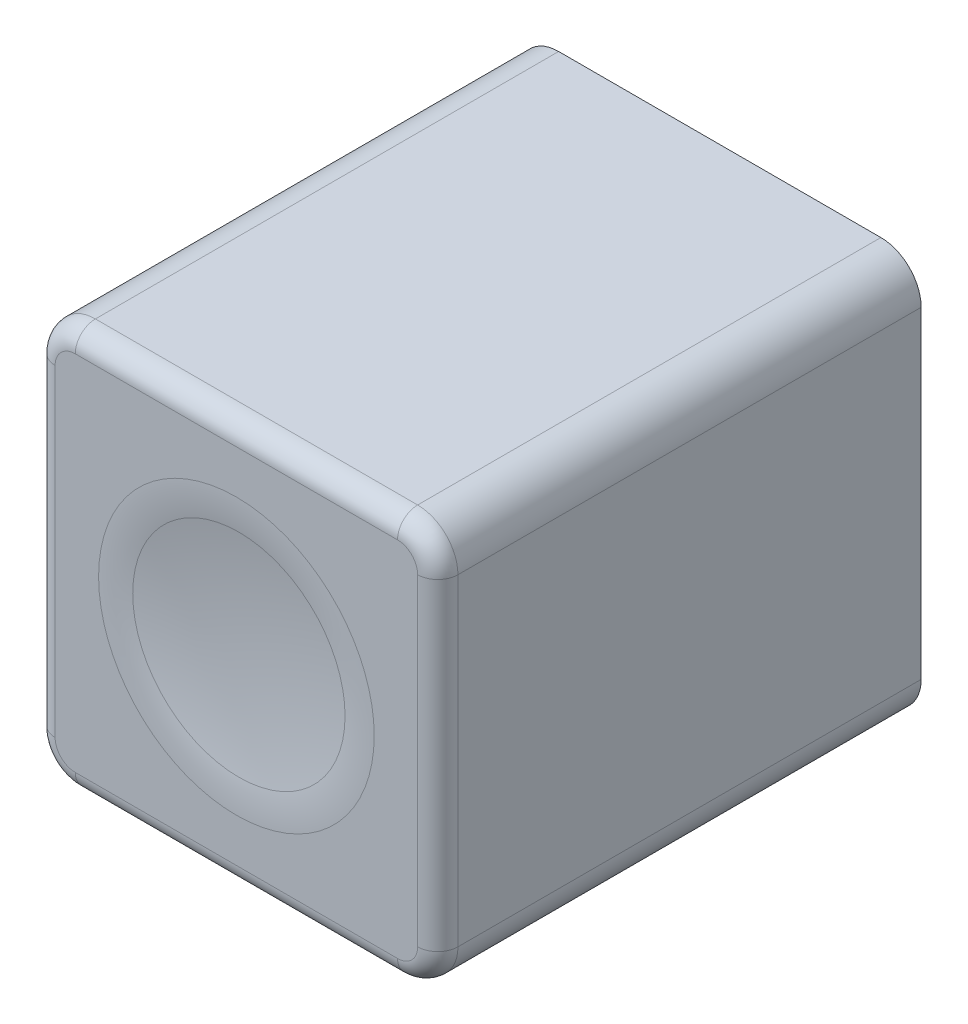
ISO-10303-21;
HEADER;
FILE_DESCRIPTION(('STEP AP214'),'2;1');
FILE_NAME('part.step','',(''),(''),'','','');
FILE_SCHEMA(('AUTOMOTIVE_DESIGN { 1 0 10303 214 1 1 1 1 }'));
ENDSEC;
DATA;
#1=APPLICATION_CONTEXT('core data for automotive mechanical design processes');
#2=APPLICATION_PROTOCOL_DEFINITION('international standard','automotive_design',2000,#1);
#3=PRODUCT_CONTEXT('',#1,'mechanical');
#4=PRODUCT('Part','Part','',(#3));
#5=PRODUCT_RELATED_PRODUCT_CATEGORY('part','',(#4));
#6=PRODUCT_DEFINITION_FORMATION('','',#4);
#7=PRODUCT_DEFINITION_CONTEXT('part definition',#1,'design');
#8=PRODUCT_DEFINITION('design','',#6,#7);
#9=PRODUCT_DEFINITION_SHAPE('','',#8);
#10=(LENGTH_UNIT() NAMED_UNIT(*) SI_UNIT(.MILLI.,.METRE.));
#11=(NAMED_UNIT(*) PLANE_ANGLE_UNIT() SI_UNIT($,.RADIAN.));
#12=(NAMED_UNIT(*) SI_UNIT($,.STERADIAN.) SOLID_ANGLE_UNIT());
#13=UNCERTAINTY_MEASURE_WITH_UNIT(LENGTH_MEASURE(1.E-05),#10,'distance_accuracy_value','');
#14=(GEOMETRIC_REPRESENTATION_CONTEXT(3) GLOBAL_UNCERTAINTY_ASSIGNED_CONTEXT((#13)) GLOBAL_UNIT_ASSIGNED_CONTEXT((#10,
#11,#12)) REPRESENTATION_CONTEXT('',''));
#15=CARTESIAN_POINT('',(0.,0.,0.));
#16=DIRECTION('',(0.,0.,1.));
#17=DIRECTION('',(1.,0.,0.));
#18=AXIS2_PLACEMENT_3D('',#15,#16,#17);
#19=CARTESIAN_POINT('',(0.,0.,2.));
#20=DIRECTION('',(0.,0.,1.));
#21=DIRECTION('',(1.,0.,0.));
#22=AXIS2_PLACEMENT_3D('',#19,#20,#21);
#23=PLANE('',#22);
#24=CARTESIAN_POINT('',(0.,0.,2.));
#25=DIRECTION('',(0.,0.,1.));
#26=DIRECTION('',(1.,0.,0.));
#27=AXIS2_PLACEMENT_3D('',#24,#25,#26);
#28=CIRCLE('',#27,3.42127144677008);
#29=CARTESIAN_POINT('',(3.42127144677008,0.,2.));
#30=VERTEX_POINT('',#29);
#31=EDGE_CURVE('E45',#30,#30,#28,.F.);
#32=ORIENTED_EDGE('',*,*,#31,.T.);
#33=EDGE_LOOP('',(#32));
#34=FACE_BOUND('',#33,.T.);
#35=DIRECTION('',(0.,-1.,0.));
#36=VECTOR('',#35,1.);
#37=CARTESIAN_POINT('',(-4.49999999999999,0.,2.));
#38=LINE('',#37,#36);
#39=CARTESIAN_POINT('',(-4.49999999999999,4.00000000000001,2.));
#40=VERTEX_POINT('',#39);
#41=CARTESIAN_POINT('',(-4.49999999999999,-3.99999999999999,2.));
#42=VERTEX_POINT('',#41);
#43=EDGE_CURVE('E183',#40,#42,#38,.T.);
#44=ORIENTED_EDGE('',*,*,#43,.T.);
#45=CARTESIAN_POINT('',(-3.99999999999999,-3.99999999999999,2.));
#46=DIRECTION('',(0.,0.,1.));
#47=DIRECTION('',(1.,0.,0.));
#48=AXIS2_PLACEMENT_3D('',#45,#46,#47);
#49=CIRCLE('',#48,0.5);
#50=CARTESIAN_POINT('',(-3.99999999999999,-4.49999999999999,2.));
#51=VERTEX_POINT('',#50);
#52=EDGE_CURVE('E185',#42,#51,#49,.T.);
#53=ORIENTED_EDGE('',*,*,#52,.T.);
#54=DIRECTION('',(1.,0.,0.));
#55=VECTOR('',#54,1.);
#56=CARTESIAN_POINT('',(0.,-4.49999999999999,2.));
#57=LINE('',#56,#55);
#58=CARTESIAN_POINT('',(4.00000000000001,-4.49999999999999,2.));
#59=VERTEX_POINT('',#58);
#60=EDGE_CURVE('E171',#51,#59,#57,.T.);
#61=ORIENTED_EDGE('',*,*,#60,.T.);
#62=CARTESIAN_POINT('',(4.00000000000001,-3.99999999999999,2.));
#63=DIRECTION('',(0.,0.,1.));
#64=DIRECTION('',(1.,0.,0.));
#65=AXIS2_PLACEMENT_3D('',#62,#63,#64);
#66=CIRCLE('',#65,0.5);
#67=CARTESIAN_POINT('',(4.50000000000001,-3.99999999999999,2.));
#68=VERTEX_POINT('',#67);
#69=EDGE_CURVE('E173',#59,#68,#66,.T.);
#70=ORIENTED_EDGE('',*,*,#69,.T.);
#71=DIRECTION('',(0.,1.,0.));
#72=VECTOR('',#71,1.);
#73=CARTESIAN_POINT('',(4.50000000000001,0.,2.));
#74=LINE('',#73,#72);
#75=CARTESIAN_POINT('',(4.50000000000001,4.00000000000001,2.));
#76=VERTEX_POINT('',#75);
#77=EDGE_CURVE('E175',#68,#76,#74,.T.);
#78=ORIENTED_EDGE('',*,*,#77,.T.);
#79=CARTESIAN_POINT('',(4.00000000000001,4.00000000000001,2.));
#80=DIRECTION('',(0.,0.,1.));
#81=DIRECTION('',(1.,0.,0.));
#82=AXIS2_PLACEMENT_3D('',#79,#80,#81);
#83=CIRCLE('',#82,0.5);
#84=CARTESIAN_POINT('',(4.00000000000001,4.50000000000001,2.));
#85=VERTEX_POINT('',#84);
#86=EDGE_CURVE('E177',#76,#85,#83,.T.);
#87=ORIENTED_EDGE('',*,*,#86,.T.);
#88=DIRECTION('',(-1.,0.,0.));
#89=VECTOR('',#88,1.);
#90=CARTESIAN_POINT('',(0.,4.50000000000001,2.));
#91=LINE('',#90,#89);
#92=CARTESIAN_POINT('',(-3.99999999999999,4.50000000000001,2.));
#93=VERTEX_POINT('',#92);
#94=EDGE_CURVE('E179',#85,#93,#91,.T.);
#95=ORIENTED_EDGE('',*,*,#94,.T.);
#96=CARTESIAN_POINT('',(-3.99999999999999,4.00000000000001,2.));
#97=DIRECTION('',(0.,0.,1.));
#98=DIRECTION('',(1.,0.,0.));
#99=AXIS2_PLACEMENT_3D('',#96,#97,#98);
#100=CIRCLE('',#99,0.5);
#101=EDGE_CURVE('E181',#93,#40,#100,.T.);
#102=ORIENTED_EDGE('',*,*,#101,.T.);
#103=EDGE_LOOP('',(#44,#53,#61,#70,#78,#87,#95,#102));
#104=FACE_BOUND('',#103,.T.);
#105=ADVANCED_FACE('F37',(#34,#104),#23,.T.);
#106=CARTESIAN_POINT('',(-4.99999999999999,5.00000000000001,-10.));
#107=DIRECTION('',(-1.,0.,0.));
#108=DIRECTION('',(0.,-1.,0.));
#109=AXIS2_PLACEMENT_3D('',#106,#107,#108);
#110=PLANE('',#109);
#111=DIRECTION('',(0.,0.,1.));
#112=VECTOR('',#111,1.);
#113=CARTESIAN_POINT('',(-4.99999999999999,-3.99999999999999,-10.));
#114=LINE('',#113,#112);
#115=CARTESIAN_POINT('',(-4.99999999999999,-3.99999999999999,-10.));
#116=VERTEX_POINT('',#115);
#117=CARTESIAN_POINT('',(-4.99999999999999,-3.99999999999999,1.5));
#118=VERTEX_POINT('',#117);
#119=EDGE_CURVE('E155',#116,#118,#114,.T.);
#120=ORIENTED_EDGE('',*,*,#119,.T.);
#121=DIRECTION('',(0.,-1.,0.));
#122=VECTOR('',#121,1.);
#123=CARTESIAN_POINT('',(-4.99999999999999,5.00000000000001,1.5));
#124=LINE('',#123,#122);
#125=CARTESIAN_POINT('',(-4.99999999999999,4.00000000000001,1.5));
#126=VERTEX_POINT('',#125);
#127=EDGE_CURVE('E190',#118,#126,#124,.F.);
#128=ORIENTED_EDGE('',*,*,#127,.T.);
#129=DIRECTION('',(0.,0.,1.));
#130=VECTOR('',#129,1.);
#131=CARTESIAN_POINT('',(-4.99999999999999,4.00000000000001,-10.));
#132=LINE('',#131,#130);
#133=CARTESIAN_POINT('',(-4.99999999999999,4.00000000000001,-10.));
#134=VERTEX_POINT('',#133);
#135=EDGE_CURVE('E158',#126,#134,#132,.F.);
#136=ORIENTED_EDGE('',*,*,#135,.T.);
#137=DIRECTION('',(0.,-1.,0.));
#138=VECTOR('',#137,1.);
#139=CARTESIAN_POINT('',(-4.99999999999999,5.00000000000001,-10.));
#140=LINE('',#139,#138);
#141=EDGE_CURVE('E150',#134,#116,#140,.T.);
#142=ORIENTED_EDGE('',*,*,#141,.T.);
#143=EDGE_LOOP('',(#120,#128,#136,#142));
#144=FACE_BOUND('',#143,.T.);
#145=ADVANCED_FACE('F238',(#144),#110,.T.);
#146=CARTESIAN_POINT('',(-4.99999999999999,5.00000000000001,-10.));
#147=DIRECTION('',(0.,1.,0.));
#148=DIRECTION('',(-1.,0.,0.));
#149=AXIS2_PLACEMENT_3D('',#146,#147,#148);
#150=PLANE('',#149);
#151=DIRECTION('',(0.,0.,1.));
#152=VECTOR('',#151,1.);
#153=CARTESIAN_POINT('',(-3.99999999999999,5.00000000000001,-10.));
#154=LINE('',#153,#152);
#155=CARTESIAN_POINT('',(-3.99999999999999,5.00000000000001,-10.));
#156=VERTEX_POINT('',#155);
#157=CARTESIAN_POINT('',(-3.99999999999999,5.00000000000001,1.5));
#158=VERTEX_POINT('',#157);
#159=EDGE_CURVE('E168',#156,#158,#154,.T.);
#160=ORIENTED_EDGE('',*,*,#159,.T.);
#161=DIRECTION('',(-1.,0.,0.));
#162=VECTOR('',#161,1.);
#163=CARTESIAN_POINT('',(-4.99999999999999,5.00000000000001,1.5));
#164=LINE('',#163,#162);
#165=CARTESIAN_POINT('',(4.00000000000001,5.00000000000001,1.5));
#166=VERTEX_POINT('',#165);
#167=EDGE_CURVE('E194',#158,#166,#164,.F.);
#168=ORIENTED_EDGE('',*,*,#167,.T.);
#169=DIRECTION('',(0.,0.,1.));
#170=VECTOR('',#169,1.);
#171=CARTESIAN_POINT('',(4.00000000000001,5.00000000000001,-10.));
#172=LINE('',#171,#170);
#173=CARTESIAN_POINT('',(4.00000000000001,5.00000000000001,-10.));
#174=VERTEX_POINT('',#173);
#175=EDGE_CURVE('E166',#166,#174,#172,.F.);
#176=ORIENTED_EDGE('',*,*,#175,.T.);
#177=DIRECTION('',(-1.,0.,0.));
#178=VECTOR('',#177,1.);
#179=CARTESIAN_POINT('',(-4.99999999999999,5.00000000000001,-10.));
#180=LINE('',#179,#178);
#181=EDGE_CURVE('E139',#174,#156,#180,.T.);
#182=ORIENTED_EDGE('',*,*,#181,.T.);
#183=EDGE_LOOP('',(#160,#168,#176,#182));
#184=FACE_BOUND('',#183,.T.);
#185=ADVANCED_FACE('F243',(#184),#150,.T.);
#186=CARTESIAN_POINT('',(5.00000000000001,5.00000000000001,-10.));
#187=DIRECTION('',(1.,0.,0.));
#188=DIRECTION('',(0.,1.,0.));
#189=AXIS2_PLACEMENT_3D('',#186,#187,#188);
#190=PLANE('',#189);
#191=DIRECTION('',(0.,0.,1.));
#192=VECTOR('',#191,1.);
#193=CARTESIAN_POINT('',(5.00000000000001,4.00000000000001,-10.));
#194=LINE('',#193,#192);
#195=CARTESIAN_POINT('',(5.00000000000001,4.00000000000001,-10.));
#196=VERTEX_POINT('',#195);
#197=CARTESIAN_POINT('',(5.00000000000001,4.00000000000001,1.5));
#198=VERTEX_POINT('',#197);
#199=EDGE_CURVE('E323',#196,#198,#194,.T.);
#200=ORIENTED_EDGE('',*,*,#199,.T.);
#201=DIRECTION('',(0.,1.,0.));
#202=VECTOR('',#201,1.);
#203=CARTESIAN_POINT('',(5.00000000000001,5.00000000000001,1.5));
#204=LINE('',#203,#202);
#205=CARTESIAN_POINT('',(5.00000000000001,-3.99999999999999,1.5));
#206=VERTEX_POINT('',#205);
#207=EDGE_CURVE('E60',#198,#206,#204,.F.);
#208=ORIENTED_EDGE('',*,*,#207,.T.);
#209=DIRECTION('',(0.,0.,1.));
#210=VECTOR('',#209,1.);
#211=CARTESIAN_POINT('',(5.00000000000001,-3.99999999999999,-10.));
#212=LINE('',#211,#210);
#213=CARTESIAN_POINT('',(5.00000000000001,-3.99999999999999,-10.));
#214=VERTEX_POINT('',#213);
#215=EDGE_CURVE('E325',#206,#214,#212,.F.);
#216=ORIENTED_EDGE('',*,*,#215,.T.);
#217=DIRECTION('',(0.,1.,0.));
#218=VECTOR('',#217,1.);
#219=CARTESIAN_POINT('',(5.00000000000001,5.00000000000001,-10.));
#220=LINE('',#219,#218);
#221=EDGE_CURVE('E149',#214,#196,#220,.T.);
#222=ORIENTED_EDGE('',*,*,#221,.T.);
#223=EDGE_LOOP('',(#200,#208,#216,#222));
#224=FACE_BOUND('',#223,.T.);
#225=ADVANCED_FACE('F252',(#224),#190,.T.);
#226=CARTESIAN_POINT('',(-4.99999999999999,-4.99999999999999,-10.));
#227=DIRECTION('',(0.,-1.,0.));
#228=DIRECTION('',(1.,0.,0.));
#229=AXIS2_PLACEMENT_3D('',#226,#227,#228);
#230=PLANE('',#229);
#231=DIRECTION('',(0.,0.,1.));
#232=VECTOR('',#231,1.);
#233=CARTESIAN_POINT('',(4.00000000000001,-4.99999999999999,-10.));
#234=LINE('',#233,#232);
#235=CARTESIAN_POINT('',(4.00000000000001,-4.99999999999999,-10.));
#236=VERTEX_POINT('',#235);
#237=CARTESIAN_POINT('',(4.00000000000001,-4.99999999999999,1.5));
#238=VERTEX_POINT('',#237);
#239=EDGE_CURVE('E138',#236,#238,#234,.T.);
#240=ORIENTED_EDGE('',*,*,#239,.T.);
#241=DIRECTION('',(1.,0.,0.));
#242=VECTOR('',#241,1.);
#243=CARTESIAN_POINT('',(-4.99999999999999,-4.99999999999999,1.5));
#244=LINE('',#243,#242);
#245=CARTESIAN_POINT('',(-3.99999999999999,-4.99999999999999,1.5));
#246=VERTEX_POINT('',#245);
#247=EDGE_CURVE('E133',#238,#246,#244,.F.);
#248=ORIENTED_EDGE('',*,*,#247,.T.);
#249=DIRECTION('',(0.,0.,1.));
#250=VECTOR('',#249,1.);
#251=CARTESIAN_POINT('',(-3.99999999999999,-4.99999999999999,-10.));
#252=LINE('',#251,#250);
#253=CARTESIAN_POINT('',(-3.99999999999999,-4.99999999999999,-10.));
#254=VERTEX_POINT('',#253);
#255=EDGE_CURVE('E128',#246,#254,#252,.F.);
#256=ORIENTED_EDGE('',*,*,#255,.T.);
#257=DIRECTION('',(1.,0.,0.));
#258=VECTOR('',#257,1.);
#259=CARTESIAN_POINT('',(-4.99999999999999,-4.99999999999999,-10.));
#260=LINE('',#259,#258);
#261=EDGE_CURVE('E131',#254,#236,#260,.T.);
#262=ORIENTED_EDGE('',*,*,#261,.T.);
#263=EDGE_LOOP('',(#240,#248,#256,#262));
#264=FACE_BOUND('',#263,.T.);
#265=ADVANCED_FACE('F130',(#264),#230,.T.);
#266=CARTESIAN_POINT('',(0.,0.,-10.));
#267=DIRECTION('',(0.,0.,1.));
#268=DIRECTION('',(1.,0.,0.));
#269=AXIS2_PLACEMENT_3D('',#266,#267,#268);
#270=PLANE('',#269);
#271=ORIENTED_EDGE('',*,*,#221,.F.);
#272=CARTESIAN_POINT('',(4.00000000000001,-3.99999999999999,-10.));
#273=DIRECTION('',(0.,0.,1.));
#274=DIRECTION('',(1.,0.,0.));
#275=AXIS2_PLACEMENT_3D('',#272,#273,#274);
#276=CIRCLE('',#275,1.);
#277=EDGE_CURVE('E148',#214,#236,#276,.F.);
#278=ORIENTED_EDGE('',*,*,#277,.T.);
#279=ORIENTED_EDGE('',*,*,#261,.F.);
#280=CARTESIAN_POINT('',(-3.99999999999999,-3.99999999999999,-10.));
#281=DIRECTION('',(0.,0.,1.));
#282=DIRECTION('',(1.,0.,0.));
#283=AXIS2_PLACEMENT_3D('',#280,#281,#282);
#284=CIRCLE('',#283,1.);
#285=EDGE_CURVE('E145',#254,#116,#284,.F.);
#286=ORIENTED_EDGE('',*,*,#285,.T.);
#287=ORIENTED_EDGE('',*,*,#141,.F.);
#288=CARTESIAN_POINT('',(-3.99999999999999,4.00000000000001,-10.));
#289=DIRECTION('',(0.,0.,1.));
#290=DIRECTION('',(1.,0.,0.));
#291=AXIS2_PLACEMENT_3D('',#288,#289,#290);
#292=CIRCLE('',#291,1.);
#293=EDGE_CURVE('E156',#134,#156,#292,.F.);
#294=ORIENTED_EDGE('',*,*,#293,.T.);
#295=ORIENTED_EDGE('',*,*,#181,.F.);
#296=CARTESIAN_POINT('',(4.00000000000001,4.00000000000001,-10.));
#297=DIRECTION('',(0.,0.,1.));
#298=DIRECTION('',(1.,0.,0.));
#299=AXIS2_PLACEMENT_3D('',#296,#297,#298);
#300=CIRCLE('',#299,1.);
#301=EDGE_CURVE('E160',#174,#196,#300,.F.);
#302=ORIENTED_EDGE('',*,*,#301,.T.);
#303=EDGE_LOOP('',(#271,#278,#279,#286,#287,#294,#295,#302));
#304=FACE_BOUND('',#303,.T.);
#305=ADVANCED_FACE('F143',(#304),#270,.F.);
#306=CARTESIAN_POINT('',(4.00000000000001,-3.99999999999999,-10.));
#307=DIRECTION('',(0.,0.,1.));
#308=DIRECTION('',(1.,0.,0.));
#309=AXIS2_PLACEMENT_3D('',#306,#307,#308);
#310=CYLINDRICAL_SURFACE('',#309,1.);
#311=ORIENTED_EDGE('',*,*,#215,.F.);
#312=CARTESIAN_POINT('',(4.00000000000001,-3.99999999999999,1.5));
#313=DIRECTION('',(0.,0.,1.));
#314=DIRECTION('',(1.,0.,0.));
#315=AXIS2_PLACEMENT_3D('',#312,#313,#314);
#316=CIRCLE('',#315,1.);
#317=EDGE_CURVE('E52',#206,#238,#316,.F.);
#318=ORIENTED_EDGE('',*,*,#317,.T.);
#319=ORIENTED_EDGE('',*,*,#239,.F.);
#320=ORIENTED_EDGE('',*,*,#277,.F.);
#321=EDGE_LOOP('',(#311,#318,#319,#320));
#322=FACE_BOUND('',#321,.T.);
#323=ADVANCED_FACE('F249',(#322),#310,.T.);
#324=CARTESIAN_POINT('',(-3.99999999999999,-3.99999999999999,-10.));
#325=DIRECTION('',(0.,0.,1.));
#326=DIRECTION('',(1.,0.,0.));
#327=AXIS2_PLACEMENT_3D('',#324,#325,#326);
#328=CYLINDRICAL_SURFACE('',#327,1.);
#329=ORIENTED_EDGE('',*,*,#255,.F.);
#330=CARTESIAN_POINT('',(-3.99999999999999,-3.99999999999999,1.5));
#331=DIRECTION('',(0.,0.,1.));
#332=DIRECTION('',(1.,0.,0.));
#333=AXIS2_PLACEMENT_3D('',#330,#331,#332);
#334=CIRCLE('',#333,1.);
#335=EDGE_CURVE('E188',#246,#118,#334,.F.);
#336=ORIENTED_EDGE('',*,*,#335,.T.);
#337=ORIENTED_EDGE('',*,*,#119,.F.);
#338=ORIENTED_EDGE('',*,*,#285,.F.);
#339=EDGE_LOOP('',(#329,#336,#337,#338));
#340=FACE_BOUND('',#339,.T.);
#341=ADVANCED_FACE('F153',(#340),#328,.T.);
#342=CARTESIAN_POINT('',(-3.99999999999999,4.00000000000001,-10.));
#343=DIRECTION('',(0.,0.,1.));
#344=DIRECTION('',(1.,0.,0.));
#345=AXIS2_PLACEMENT_3D('',#342,#343,#344);
#346=CYLINDRICAL_SURFACE('',#345,1.);
#347=ORIENTED_EDGE('',*,*,#135,.F.);
#348=CARTESIAN_POINT('',(-3.99999999999999,4.00000000000001,1.5));
#349=DIRECTION('',(0.,0.,1.));
#350=DIRECTION('',(1.,0.,0.));
#351=AXIS2_PLACEMENT_3D('',#348,#349,#350);
#352=CIRCLE('',#351,1.);
#353=EDGE_CURVE('E192',#126,#158,#352,.F.);
#354=ORIENTED_EDGE('',*,*,#353,.T.);
#355=ORIENTED_EDGE('',*,*,#159,.F.);
#356=ORIENTED_EDGE('',*,*,#293,.F.);
#357=EDGE_LOOP('',(#347,#354,#355,#356));
#358=FACE_BOUND('',#357,.T.);
#359=ADVANCED_FACE('F262',(#358),#346,.T.);
#360=CARTESIAN_POINT('',(4.00000000000001,4.00000000000001,-10.));
#361=DIRECTION('',(0.,0.,1.));
#362=DIRECTION('',(1.,0.,0.));
#363=AXIS2_PLACEMENT_3D('',#360,#361,#362);
#364=CYLINDRICAL_SURFACE('',#363,1.);
#365=ORIENTED_EDGE('',*,*,#175,.F.);
#366=CARTESIAN_POINT('',(4.00000000000001,4.00000000000001,1.5));
#367=DIRECTION('',(0.,0.,1.));
#368=DIRECTION('',(1.,0.,0.));
#369=AXIS2_PLACEMENT_3D('',#366,#367,#368);
#370=CIRCLE('',#369,1.);
#371=EDGE_CURVE('E196',#166,#198,#370,.F.);
#372=ORIENTED_EDGE('',*,*,#371,.T.);
#373=ORIENTED_EDGE('',*,*,#199,.F.);
#374=ORIENTED_EDGE('',*,*,#301,.F.);
#375=EDGE_LOOP('',(#365,#372,#373,#374));
#376=FACE_BOUND('',#375,.T.);
#377=ADVANCED_FACE('F265',(#376),#364,.T.);
#378=CARTESIAN_POINT('',(4.00000000000001,4.00000000000001,1.5));
#379=DIRECTION('',(0.,0.,1.));
#380=DIRECTION('',(1.,0.,0.));
#381=AXIS2_PLACEMENT_3D('',#378,#379,#380);
#382=DEGENERATE_TOROIDAL_SURFACE('',#381,0.5,0.5,.T.);
#383=CARTESIAN_POINT('',(4.50000000000001,4.00000000000001,1.5));
#384=DIRECTION('',(0.,-1.,0.));
#385=DIRECTION('',(0.,0.,-1.));
#386=AXIS2_PLACEMENT_3D('',#383,#384,#385);
#387=CIRCLE('',#386,0.5);
#388=EDGE_CURVE('E217',#198,#76,#387,.T.);
#389=ORIENTED_EDGE('',*,*,#388,.F.);
#390=ORIENTED_EDGE('',*,*,#371,.F.);
#391=CARTESIAN_POINT('',(4.00000000000001,4.50000000000001,1.5));
#392=DIRECTION('',(-1.,0.,0.));
#393=DIRECTION('',(0.,0.,1.));
#394=AXIS2_PLACEMENT_3D('',#391,#392,#393);
#395=CIRCLE('',#394,0.5);
#396=EDGE_CURVE('E220',#85,#166,#395,.T.);
#397=ORIENTED_EDGE('',*,*,#396,.F.);
#398=ORIENTED_EDGE('',*,*,#86,.F.);
#399=EDGE_LOOP('',(#389,#390,#397,#398));
#400=FACE_BOUND('',#399,.T.);
#401=ADVANCED_FACE('F269',(#400),#382,.T.);
#402=CARTESIAN_POINT('',(0.,4.50000000000001,1.5));
#403=DIRECTION('',(-1.,0.,0.));
#404=DIRECTION('',(0.,-1.,0.));
#405=AXIS2_PLACEMENT_3D('',#402,#403,#404);
#406=CYLINDRICAL_SURFACE('',#405,0.5);
#407=ORIENTED_EDGE('',*,*,#396,.T.);
#408=ORIENTED_EDGE('',*,*,#167,.F.);
#409=CARTESIAN_POINT('',(-3.99999999999999,4.50000000000001,1.5));
#410=DIRECTION('',(-1.,0.,0.));
#411=DIRECTION('',(0.,0.,1.));
#412=AXIS2_PLACEMENT_3D('',#409,#410,#411);
#413=CIRCLE('',#412,0.5);
#414=EDGE_CURVE('E214',#93,#158,#413,.T.);
#415=ORIENTED_EDGE('',*,*,#414,.F.);
#416=ORIENTED_EDGE('',*,*,#94,.F.);
#417=EDGE_LOOP('',(#407,#408,#415,#416));
#418=FACE_BOUND('',#417,.T.);
#419=ADVANCED_FACE('F293',(#418),#406,.T.);
#420=CARTESIAN_POINT('',(4.50000000000001,0.,1.5));
#421=DIRECTION('',(0.,1.,0.));
#422=DIRECTION('',(-1.,0.,0.));
#423=AXIS2_PLACEMENT_3D('',#420,#421,#422);
#424=CYLINDRICAL_SURFACE('',#423,0.5);
#425=ORIENTED_EDGE('',*,*,#388,.T.);
#426=ORIENTED_EDGE('',*,*,#77,.F.);
#427=CARTESIAN_POINT('',(4.50000000000001,-3.99999999999999,1.5));
#428=DIRECTION('',(0.,-1.,0.));
#429=DIRECTION('',(0.,0.,-1.));
#430=AXIS2_PLACEMENT_3D('',#427,#428,#429);
#431=CIRCLE('',#430,0.5);
#432=EDGE_CURVE('E211',#206,#68,#431,.T.);
#433=ORIENTED_EDGE('',*,*,#432,.F.);
#434=ORIENTED_EDGE('',*,*,#207,.F.);
#435=EDGE_LOOP('',(#425,#426,#433,#434));
#436=FACE_BOUND('',#435,.T.);
#437=ADVANCED_FACE('F289',(#436),#424,.T.);
#438=CARTESIAN_POINT('',(-3.99999999999999,4.00000000000001,1.5));
#439=DIRECTION('',(0.,0.,1.));
#440=DIRECTION('',(1.,0.,0.));
#441=AXIS2_PLACEMENT_3D('',#438,#439,#440);
#442=DEGENERATE_TOROIDAL_SURFACE('',#441,0.5,0.5,.T.);
#443=ORIENTED_EDGE('',*,*,#414,.T.);
#444=ORIENTED_EDGE('',*,*,#353,.F.);
#445=CARTESIAN_POINT('',(-4.49999999999999,4.00000000000001,1.5));
#446=DIRECTION('',(0.,-1.,0.));
#447=DIRECTION('',(0.,0.,-1.));
#448=AXIS2_PLACEMENT_3D('',#445,#446,#447);
#449=CIRCLE('',#448,0.5);
#450=EDGE_CURVE('E208',#40,#126,#449,.T.);
#451=ORIENTED_EDGE('',*,*,#450,.F.);
#452=ORIENTED_EDGE('',*,*,#101,.F.);
#453=EDGE_LOOP('',(#443,#444,#451,#452));
#454=FACE_BOUND('',#453,.T.);
#455=ADVANCED_FACE('F285',(#454),#442,.T.);
#456=CARTESIAN_POINT('',(4.00000000000001,-3.99999999999999,1.5));
#457=DIRECTION('',(0.,0.,1.));
#458=DIRECTION('',(1.,0.,0.));
#459=AXIS2_PLACEMENT_3D('',#456,#457,#458);
#460=DEGENERATE_TOROIDAL_SURFACE('',#459,0.5,0.5,.T.);
#461=ORIENTED_EDGE('',*,*,#432,.T.);
#462=ORIENTED_EDGE('',*,*,#69,.F.);
#463=CARTESIAN_POINT('',(4.00000000000001,-4.49999999999999,1.5));
#464=DIRECTION('',(-1.,0.,0.));
#465=DIRECTION('',(0.,0.,1.));
#466=AXIS2_PLACEMENT_3D('',#463,#464,#465);
#467=CIRCLE('',#466,0.5);
#468=EDGE_CURVE('E205',#238,#59,#467,.T.);
#469=ORIENTED_EDGE('',*,*,#468,.F.);
#470=ORIENTED_EDGE('',*,*,#317,.F.);
#471=EDGE_LOOP('',(#461,#462,#469,#470));
#472=FACE_BOUND('',#471,.T.);
#473=ADVANCED_FACE('F281',(#472),#460,.T.);
#474=CARTESIAN_POINT('',(-4.49999999999999,0.,1.5));
#475=DIRECTION('',(0.,-1.,0.));
#476=DIRECTION('',(1.,0.,0.));
#477=AXIS2_PLACEMENT_3D('',#474,#475,#476);
#478=CYLINDRICAL_SURFACE('',#477,0.5);
#479=ORIENTED_EDGE('',*,*,#450,.T.);
#480=ORIENTED_EDGE('',*,*,#127,.F.);
#481=CARTESIAN_POINT('',(-4.49999999999999,-3.99999999999999,1.5));
#482=DIRECTION('',(0.,-1.,0.));
#483=DIRECTION('',(0.,0.,-1.));
#484=AXIS2_PLACEMENT_3D('',#481,#482,#483);
#485=CIRCLE('',#484,0.5);
#486=EDGE_CURVE('E203',#42,#118,#485,.T.);
#487=ORIENTED_EDGE('',*,*,#486,.F.);
#488=ORIENTED_EDGE('',*,*,#43,.F.);
#489=EDGE_LOOP('',(#479,#480,#487,#488));
#490=FACE_BOUND('',#489,.T.);
#491=ADVANCED_FACE('F277',(#490),#478,.T.);
#492=CARTESIAN_POINT('',(0.,-4.49999999999999,1.5));
#493=DIRECTION('',(1.,0.,0.));
#494=DIRECTION('',(0.,1.,0.));
#495=AXIS2_PLACEMENT_3D('',#492,#493,#494);
#496=CYLINDRICAL_SURFACE('',#495,0.5);
#497=ORIENTED_EDGE('',*,*,#468,.T.);
#498=ORIENTED_EDGE('',*,*,#60,.F.);
#499=CARTESIAN_POINT('',(-3.99999999999999,-4.49999999999999,1.5));
#500=DIRECTION('',(-1.,0.,0.));
#501=DIRECTION('',(0.,0.,1.));
#502=AXIS2_PLACEMENT_3D('',#499,#500,#501);
#503=CIRCLE('',#502,0.5);
#504=EDGE_CURVE('E201',#246,#51,#503,.T.);
#505=ORIENTED_EDGE('',*,*,#504,.F.);
#506=ORIENTED_EDGE('',*,*,#247,.F.);
#507=EDGE_LOOP('',(#497,#498,#505,#506));
#508=FACE_BOUND('',#507,.T.);
#509=ADVANCED_FACE('F273',(#508),#496,.T.);
#510=CARTESIAN_POINT('',(-3.99999999999999,-3.99999999999999,1.5));
#511=DIRECTION('',(0.,0.,1.));
#512=DIRECTION('',(1.,0.,0.));
#513=AXIS2_PLACEMENT_3D('',#510,#511,#512);
#514=DEGENERATE_TOROIDAL_SURFACE('',#513,0.5,0.5,.T.);
#515=ORIENTED_EDGE('',*,*,#486,.T.);
#516=ORIENTED_EDGE('',*,*,#335,.F.);
#517=ORIENTED_EDGE('',*,*,#504,.T.);
#518=ORIENTED_EDGE('',*,*,#52,.F.);
#519=EDGE_LOOP('',(#515,#516,#517,#518));
#520=FACE_BOUND('',#519,.T.);
#521=ADVANCED_FACE('F233',(#520),#514,.T.);
#522=CARTESIAN_POINT('',(0.,0.,18.5));
#523=DIRECTION('',(0.,0.,-1.));
#524=DIRECTION('',(0.,1.,0.));
#525=AXIS2_PLACEMENT_3D('',#522,#523,#524);
#526=SPHERICAL_SURFACE('',#525,16.7705098312484);
#527=CARTESIAN_POINT('',(0.,0.,1.93787241701154));
#528=DIRECTION('',(0.,0.,1.));
#529=DIRECTION('',(1.,0.,0.));
#530=AXIS2_PLACEMENT_3D('',#527,#528,#529);
#531=CIRCLE('',#530,2.63551321848565);
#532=CARTESIAN_POINT('',(2.63551321848565,0.,1.93787241701154));
#533=VERTEX_POINT('',#532);
#534=EDGE_CURVE('E11',#533,#533,#531,.T.);
#535=ORIENTED_EDGE('',*,*,#534,.T.);
#536=EDGE_LOOP('',(#535));
#537=FACE_BOUND('',#536,.T.);
#538=ADVANCED_FACE('F228',(#537),#526,.F.);
#539=CARTESIAN_POINT('',(0.,0.,-3.));
#540=DIRECTION('',(0.,0.,1.));
#541=DIRECTION('',(1.,0.,0.));
#542=AXIS2_PLACEMENT_3D('',#539,#540,#541);
#543=DEGENERATE_TOROIDAL_SURFACE('',#542,3.42127144677008,5.,.T.);
#544=ORIENTED_EDGE('',*,*,#534,.F.);
#545=EDGE_LOOP('',(#544));
#546=FACE_BOUND('',#545,.T.);
#547=ORIENTED_EDGE('',*,*,#31,.F.);
#548=EDGE_LOOP('',(#547));
#549=FACE_BOUND('',#548,.T.);
#550=ADVANCED_FACE('F39',(#546,#549),#543,.T.);
#551=CLOSED_SHELL('',(#105,#145,#185,#225,#265,#305,#323,#341,#359,#377,#401,#419,#437,#455,
#473,#491,#509,#521,#538,#550));
#552=MANIFOLD_SOLID_BREP('B2',#551);
#553=ADVANCED_BREP_SHAPE_REPRESENTATION('',(#18,#552),#14);
#554=SHAPE_DEFINITION_REPRESENTATION(#9,#553);
ENDSEC;
END-ISO-10303-21;
